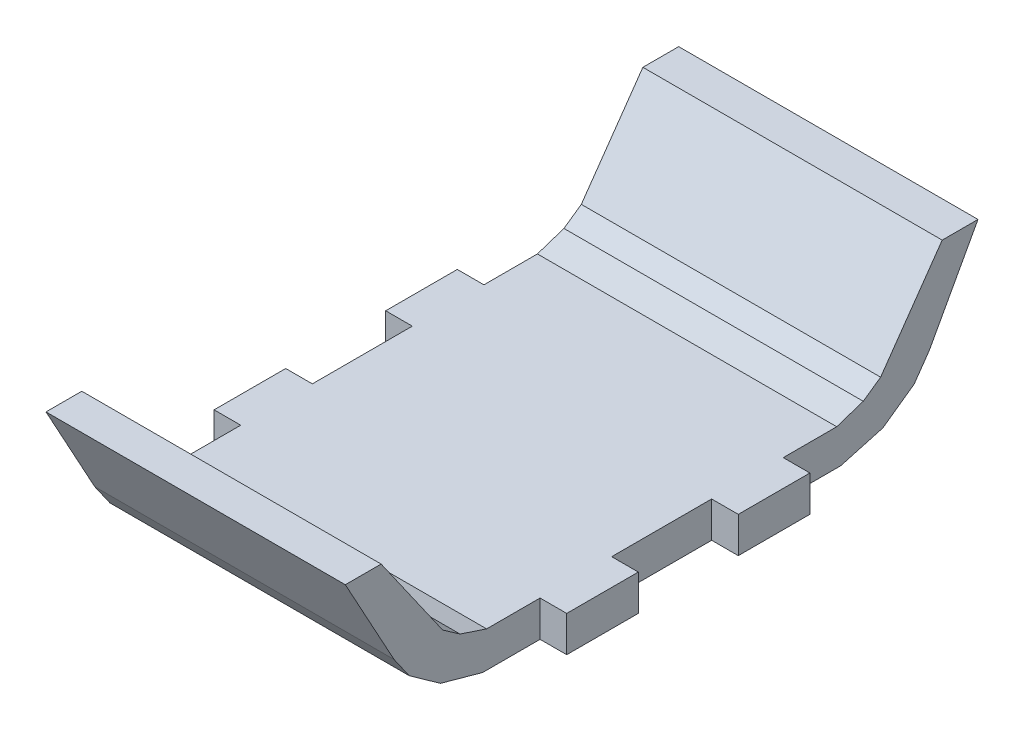
ISO-10303-21;
HEADER;
FILE_DESCRIPTION(('STEP AP214'),'2;1');
FILE_NAME('part.step','',(''),(''),'','','');
FILE_SCHEMA(('AUTOMOTIVE_DESIGN { 1 0 10303 214 1 1 1 1 }'));
ENDSEC;
DATA;
#1=APPLICATION_CONTEXT('core data for automotive mechanical design processes');
#2=APPLICATION_PROTOCOL_DEFINITION('international standard','automotive_design',2000,#1);
#3=PRODUCT_CONTEXT('',#1,'mechanical');
#4=PRODUCT('Part','Part','',(#3));
#5=PRODUCT_RELATED_PRODUCT_CATEGORY('part','',(#4));
#6=PRODUCT_DEFINITION_FORMATION('','',#4);
#7=PRODUCT_DEFINITION_CONTEXT('part definition',#1,'design');
#8=PRODUCT_DEFINITION('design','',#6,#7);
#9=PRODUCT_DEFINITION_SHAPE('','',#8);
#10=(LENGTH_UNIT() NAMED_UNIT(*) SI_UNIT(.MILLI.,.METRE.));
#11=(NAMED_UNIT(*) PLANE_ANGLE_UNIT() SI_UNIT($,.RADIAN.));
#12=(NAMED_UNIT(*) SI_UNIT($,.STERADIAN.) SOLID_ANGLE_UNIT());
#13=UNCERTAINTY_MEASURE_WITH_UNIT(LENGTH_MEASURE(1.E-05),#10,'distance_accuracy_value','');
#14=(GEOMETRIC_REPRESENTATION_CONTEXT(3) GLOBAL_UNCERTAINTY_ASSIGNED_CONTEXT((#13)) GLOBAL_UNIT_ASSIGNED_CONTEXT((#10,
#11,#12)) REPRESENTATION_CONTEXT('',''));
#15=CARTESIAN_POINT('',(0.,0.,0.));
#16=DIRECTION('',(0.,0.,1.));
#17=DIRECTION('',(1.,0.,0.));
#18=AXIS2_PLACEMENT_3D('',#15,#16,#17);
#19=CARTESIAN_POINT('',(10.45,2.5,8.49));
#20=DIRECTION('',(-1.,0.,0.));
#21=DIRECTION('',(0.,0.,1.));
#22=AXIS2_PLACEMENT_3D('',#19,#20,#21);
#23=PLANE('',#22);
#24=DIRECTION('',(0.,0.266976936378125,0.963702918664331));
#25=VECTOR('',#24,1.);
#26=CARTESIAN_POINT('',(10.45,-3.21608066004576,0.890958556973117));
#27=LINE('',#26,#25);
#28=CARTESIAN_POINT('',(10.45,0.,12.5));
#29=VERTEX_POINT('',#28);
#30=CARTESIAN_POINT('',(10.45,0.816274422686444,15.4464943835441));
#31=VERTEX_POINT('',#30);
#32=EDGE_CURVE('E297',#29,#31,#27,.T.);
#33=ORIENTED_EDGE('',*,*,#32,.F.);
#34=DIRECTION('',(0.,0.,-1.));
#35=VECTOR('',#34,1.);
#36=CARTESIAN_POINT('',(10.45,0.,8.49));
#37=LINE('',#36,#35);
#38=CARTESIAN_POINT('',(10.45,0.,8.49));
#39=VERTEX_POINT('',#38);
#40=EDGE_CURVE('E362',#29,#39,#37,.T.);
#41=ORIENTED_EDGE('',*,*,#40,.T.);
#42=DIRECTION('',(0.,-1.,0.));
#43=VECTOR('',#42,1.);
#44=CARTESIAN_POINT('',(10.45,2.5,8.49));
#45=LINE('',#44,#43);
#46=CARTESIAN_POINT('',(10.45,2.5,8.49));
#47=VERTEX_POINT('',#46);
#48=EDGE_CURVE('E11',#47,#39,#45,.T.);
#49=ORIENTED_EDGE('',*,*,#48,.F.);
#50=DIRECTION('',(0.,0.,-1.));
#51=VECTOR('',#50,1.);
#52=CARTESIAN_POINT('',(10.45,2.5,8.49));
#53=LINE('',#52,#51);
#54=CARTESIAN_POINT('',(10.45,2.5,12.2230371699178));
#55=VERTEX_POINT('',#54);
#56=EDGE_CURVE('E278',#55,#47,#53,.T.);
#57=ORIENTED_EDGE('',*,*,#56,.F.);
#58=DIRECTION('',(0.,0.315026182678689,0.949082980685511));
#59=VECTOR('',#58,1.);
#60=CARTESIAN_POINT('',(10.45,-1.4026205895499,0.465567520506252));
#61=LINE('',#60,#59);
#62=CARTESIAN_POINT('',(10.45,3.11522762752308,14.0765404741979));
#63=VERTEX_POINT('',#62);
#64=EDGE_CURVE('E260',#55,#63,#61,.T.);
#65=ORIENTED_EDGE('',*,*,#64,.T.);
#66=DIRECTION('',(0.,0.573576436351049,0.81915204428899));
#67=VECTOR('',#66,1.);
#68=CARTESIAN_POINT('',(10.45,-4.52346149130867,3.16736183501569));
#69=LINE('',#68,#67);
#70=CARTESIAN_POINT('',(10.45,3.96450824542418,15.289438895818));
#71=VERTEX_POINT('',#70);
#72=EDGE_CURVE('E275',#63,#71,#69,.T.);
#73=ORIENTED_EDGE('',*,*,#72,.T.);
#74=DIRECTION('',(0.,0.819152044288989,0.57357643635105));
#75=VECTOR('',#74,1.);
#76=CARTESIAN_POINT('',(10.45,-5.87940316962442,8.39665791753229));
#77=LINE('',#76,#75);
#78=CARTESIAN_POINT('',(10.45,10.1036954268661,19.5881440387441));
#79=VERTEX_POINT('',#78);
#80=EDGE_CURVE('E281',#71,#79,#77,.T.);
#81=ORIENTED_EDGE('',*,*,#80,.T.);
#82=DIRECTION('',(0.,0.,-1.));
#83=VECTOR('',#82,1.);
#84=CARTESIAN_POINT('',(10.45,10.1036954268661,0.));
#85=LINE('',#84,#83);
#86=CARTESIAN_POINT('',(10.45,10.1036954268661,22.0881440387441));
#87=VERTEX_POINT('',#86);
#88=EDGE_CURVE('E283',#87,#79,#85,.T.);
#89=ORIENTED_EDGE('',*,*,#88,.F.);
#90=DIRECTION('',(0.,0.877397149037787,0.47976477867843));
#91=VECTOR('',#90,1.);
#92=CARTESIAN_POINT('',(10.45,-6.97226675969061,12.7509297246345));
#93=LINE('',#92,#91);
#94=CARTESIAN_POINT('',(10.45,3.8818307141463,18.6859999240308));
#95=VERTEX_POINT('',#94);
#96=EDGE_CURVE('E288',#95,#87,#93,.T.);
#97=ORIENTED_EDGE('',*,*,#96,.F.);
#98=DIRECTION('',(0.,-0.819152044288989,-0.57357643635105));
#99=VECTOR('',#98,1.);
#100=CARTESIAN_POINT('',(10.45,-7.50246491184491,10.7146303095038));
#101=LINE('',#100,#99);
#102=CARTESIAN_POINT('',(10.45,2.37201677513664,17.6288168226421));
#103=VERTEX_POINT('',#102);
#104=EDGE_CURVE('E291',#95,#103,#101,.T.);
#105=ORIENTED_EDGE('',*,*,#104,.T.);
#106=DIRECTION('',(0.,-0.580482067399487,-0.814273031254024));
#107=VECTOR('',#106,1.);
#108=CARTESIAN_POINT('',(10.45,-6.75988522993769,4.81901279183265));
#109=LINE('',#108,#107);
#110=EDGE_CURVE('E294',#103,#31,#109,.T.);
#111=ORIENTED_EDGE('',*,*,#110,.T.);
#112=EDGE_LOOP('',(#33,#41,#49,#57,#65,#73,#81,#89,#97,#105,#111));
#113=FACE_BOUND('',#112,.T.);
#114=ADVANCED_FACE('F38',(#113),#23,.F.);
#115=CARTESIAN_POINT('',(10.45,2.5,8.49));
#116=DIRECTION('',(0.,0.,-1.));
#117=DIRECTION('',(-1.,0.,0.));
#118=AXIS2_PLACEMENT_3D('',#115,#116,#117);
#119=PLANE('',#118);
#120=DIRECTION('',(1.,0.,0.));
#121=VECTOR('',#120,1.);
#122=CARTESIAN_POINT('',(10.45,0.,8.49));
#123=LINE('',#122,#121);
#124=CARTESIAN_POINT('',(12.3099352059768,0.,8.49));
#125=VERTEX_POINT('',#124);
#126=EDGE_CURVE('E427',#39,#125,#123,.T.);
#127=ORIENTED_EDGE('',*,*,#126,.T.);
#128=DIRECTION('',(0.,-1.,0.));
#129=VECTOR('',#128,1.);
#130=CARTESIAN_POINT('',(12.3099352059768,2.5,8.49));
#131=LINE('',#130,#129);
#132=CARTESIAN_POINT('',(12.3099352059768,2.5,8.49));
#133=VERTEX_POINT('',#132);
#134=EDGE_CURVE('E45',#133,#125,#131,.T.);
#135=ORIENTED_EDGE('',*,*,#134,.F.);
#136=DIRECTION('',(1.,0.,0.));
#137=VECTOR('',#136,1.);
#138=CARTESIAN_POINT('',(10.45,2.5,8.49));
#139=LINE('',#138,#137);
#140=EDGE_CURVE('E390',#47,#133,#139,.T.);
#141=ORIENTED_EDGE('',*,*,#140,.F.);
#142=ORIENTED_EDGE('',*,*,#48,.T.);
#143=EDGE_LOOP('',(#127,#135,#141,#142));
#144=FACE_BOUND('',#143,.T.);
#145=ADVANCED_FACE('F531',(#144),#119,.F.);
#146=CARTESIAN_POINT('',(12.3099352059768,2.5,3.49));
#147=DIRECTION('',(-1.,0.,0.));
#148=DIRECTION('',(0.,0.,1.));
#149=AXIS2_PLACEMENT_3D('',#146,#147,#148);
#150=PLANE('',#149);
#151=DIRECTION('',(0.,0.,-1.));
#152=VECTOR('',#151,1.);
#153=CARTESIAN_POINT('',(12.3099352059768,0.,3.49));
#154=LINE('',#153,#152);
#155=CARTESIAN_POINT('',(12.3099352059768,0.,3.49));
#156=VERTEX_POINT('',#155);
#157=EDGE_CURVE('E429',#125,#156,#154,.T.);
#158=ORIENTED_EDGE('',*,*,#157,.T.);
#159=DIRECTION('',(0.,-1.,0.));
#160=VECTOR('',#159,1.);
#161=CARTESIAN_POINT('',(12.3099352059768,2.5,3.49));
#162=LINE('',#161,#160);
#163=CARTESIAN_POINT('',(12.3099352059768,2.5,3.49));
#164=VERTEX_POINT('',#163);
#165=EDGE_CURVE('E504',#164,#156,#162,.T.);
#166=ORIENTED_EDGE('',*,*,#165,.F.);
#167=DIRECTION('',(0.,0.,-1.));
#168=VECTOR('',#167,1.);
#169=CARTESIAN_POINT('',(12.3099352059768,2.5,3.49));
#170=LINE('',#169,#168);
#171=EDGE_CURVE('E393',#133,#164,#170,.T.);
#172=ORIENTED_EDGE('',*,*,#171,.F.);
#173=ORIENTED_EDGE('',*,*,#134,.T.);
#174=EDGE_LOOP('',(#158,#166,#172,#173));
#175=FACE_BOUND('',#174,.T.);
#176=ADVANCED_FACE('F511',(#175),#150,.F.);
#177=CARTESIAN_POINT('',(10.45,2.5,3.49));
#178=DIRECTION('',(0.,0.,1.));
#179=DIRECTION('',(1.,0.,0.));
#180=AXIS2_PLACEMENT_3D('',#177,#178,#179);
#181=PLANE('',#180);
#182=DIRECTION('',(-1.,0.,0.));
#183=VECTOR('',#182,1.);
#184=CARTESIAN_POINT('',(10.45,0.,3.49));
#185=LINE('',#184,#183);
#186=CARTESIAN_POINT('',(10.45,0.,3.49));
#187=VERTEX_POINT('',#186);
#188=EDGE_CURVE('E431',#156,#187,#185,.T.);
#189=ORIENTED_EDGE('',*,*,#188,.T.);
#190=DIRECTION('',(0.,-1.,0.));
#191=VECTOR('',#190,1.);
#192=CARTESIAN_POINT('',(10.45,2.5,3.49));
#193=LINE('',#192,#191);
#194=CARTESIAN_POINT('',(10.45,2.5,3.49));
#195=VERTEX_POINT('',#194);
#196=EDGE_CURVE('E501',#195,#187,#193,.T.);
#197=ORIENTED_EDGE('',*,*,#196,.F.);
#198=DIRECTION('',(-1.,0.,0.));
#199=VECTOR('',#198,1.);
#200=CARTESIAN_POINT('',(10.45,2.5,3.49));
#201=LINE('',#200,#199);
#202=EDGE_CURVE('E395',#164,#195,#201,.T.);
#203=ORIENTED_EDGE('',*,*,#202,.F.);
#204=ORIENTED_EDGE('',*,*,#165,.T.);
#205=EDGE_LOOP('',(#189,#197,#203,#204));
#206=FACE_BOUND('',#205,.T.);
#207=ADVANCED_FACE('F522',(#206),#181,.F.);
#208=CARTESIAN_POINT('',(10.45,2.5,-3.49));
#209=DIRECTION('',(-1.,0.,0.));
#210=DIRECTION('',(0.,0.,1.));
#211=AXIS2_PLACEMENT_3D('',#208,#209,#210);
#212=PLANE('',#211);
#213=DIRECTION('',(0.,0.,-1.));
#214=VECTOR('',#213,1.);
#215=CARTESIAN_POINT('',(10.45,0.,-3.49));
#216=LINE('',#215,#214);
#217=CARTESIAN_POINT('',(10.45,0.,-3.49));
#218=VERTEX_POINT('',#217);
#219=EDGE_CURVE('E433',#187,#218,#216,.T.);
#220=ORIENTED_EDGE('',*,*,#219,.T.);
#221=DIRECTION('',(0.,-1.,0.));
#222=VECTOR('',#221,1.);
#223=CARTESIAN_POINT('',(10.45,2.5,-3.49));
#224=LINE('',#223,#222);
#225=CARTESIAN_POINT('',(10.45,2.5,-3.49));
#226=VERTEX_POINT('',#225);
#227=EDGE_CURVE('E498',#226,#218,#224,.T.);
#228=ORIENTED_EDGE('',*,*,#227,.F.);
#229=DIRECTION('',(0.,0.,-1.));
#230=VECTOR('',#229,1.);
#231=CARTESIAN_POINT('',(10.45,2.5,-3.49));
#232=LINE('',#231,#230);
#233=EDGE_CURVE('E397',#195,#226,#232,.T.);
#234=ORIENTED_EDGE('',*,*,#233,.F.);
#235=ORIENTED_EDGE('',*,*,#196,.T.);
#236=EDGE_LOOP('',(#220,#228,#234,#235));
#237=FACE_BOUND('',#236,.T.);
#238=ADVANCED_FACE('F526',(#237),#212,.F.);
#239=CARTESIAN_POINT('',(10.45,2.5,-3.49));
#240=DIRECTION('',(0.,0.,-1.));
#241=DIRECTION('',(-1.,0.,0.));
#242=AXIS2_PLACEMENT_3D('',#239,#240,#241);
#243=PLANE('',#242);
#244=DIRECTION('',(1.,0.,0.));
#245=VECTOR('',#244,1.);
#246=CARTESIAN_POINT('',(10.45,0.,-3.49));
#247=LINE('',#246,#245);
#248=CARTESIAN_POINT('',(12.3099352059768,0.,-3.49));
#249=VERTEX_POINT('',#248);
#250=EDGE_CURVE('E435',#218,#249,#247,.T.);
#251=ORIENTED_EDGE('',*,*,#250,.T.);
#252=DIRECTION('',(0.,-1.,0.));
#253=VECTOR('',#252,1.);
#254=CARTESIAN_POINT('',(12.3099352059768,2.5,-3.49));
#255=LINE('',#254,#253);
#256=CARTESIAN_POINT('',(12.3099352059768,2.5,-3.49));
#257=VERTEX_POINT('',#256);
#258=EDGE_CURVE('E495',#257,#249,#255,.T.);
#259=ORIENTED_EDGE('',*,*,#258,.F.);
#260=DIRECTION('',(1.,0.,0.));
#261=VECTOR('',#260,1.);
#262=CARTESIAN_POINT('',(10.45,2.5,-3.49));
#263=LINE('',#262,#261);
#264=EDGE_CURVE('E399',#226,#257,#263,.T.);
#265=ORIENTED_EDGE('',*,*,#264,.F.);
#266=ORIENTED_EDGE('',*,*,#227,.T.);
#267=EDGE_LOOP('',(#251,#259,#265,#266));
#268=FACE_BOUND('',#267,.T.);
#269=ADVANCED_FACE('F605',(#268),#243,.F.);
#270=CARTESIAN_POINT('',(12.3099352059768,2.5,-8.49));
#271=DIRECTION('',(-1.,0.,0.));
#272=DIRECTION('',(0.,0.,1.));
#273=AXIS2_PLACEMENT_3D('',#270,#271,#272);
#274=PLANE('',#273);
#275=DIRECTION('',(0.,0.,-1.));
#276=VECTOR('',#275,1.);
#277=CARTESIAN_POINT('',(12.3099352059768,0.,-8.49));
#278=LINE('',#277,#276);
#279=CARTESIAN_POINT('',(12.3099352059768,0.,-8.49));
#280=VERTEX_POINT('',#279);
#281=EDGE_CURVE('E437',#249,#280,#278,.T.);
#282=ORIENTED_EDGE('',*,*,#281,.T.);
#283=DIRECTION('',(0.,-1.,0.));
#284=VECTOR('',#283,1.);
#285=CARTESIAN_POINT('',(12.3099352059768,2.5,-8.49));
#286=LINE('',#285,#284);
#287=CARTESIAN_POINT('',(12.3099352059768,2.5,-8.49));
#288=VERTEX_POINT('',#287);
#289=EDGE_CURVE('E492',#288,#280,#286,.T.);
#290=ORIENTED_EDGE('',*,*,#289,.F.);
#291=DIRECTION('',(0.,0.,-1.));
#292=VECTOR('',#291,1.);
#293=CARTESIAN_POINT('',(12.3099352059768,2.5,-8.49));
#294=LINE('',#293,#292);
#295=EDGE_CURVE('E401',#257,#288,#294,.T.);
#296=ORIENTED_EDGE('',*,*,#295,.F.);
#297=ORIENTED_EDGE('',*,*,#258,.T.);
#298=EDGE_LOOP('',(#282,#290,#296,#297));
#299=FACE_BOUND('',#298,.T.);
#300=ADVANCED_FACE('F603',(#299),#274,.F.);
#301=CARTESIAN_POINT('',(10.45,2.5,-8.49));
#302=DIRECTION('',(0.,0.,1.));
#303=DIRECTION('',(1.,0.,0.));
#304=AXIS2_PLACEMENT_3D('',#301,#302,#303);
#305=PLANE('',#304);
#306=DIRECTION('',(-1.,0.,0.));
#307=VECTOR('',#306,1.);
#308=CARTESIAN_POINT('',(10.45,0.,-8.49));
#309=LINE('',#308,#307);
#310=CARTESIAN_POINT('',(10.45,0.,-8.49));
#311=VERTEX_POINT('',#310);
#312=EDGE_CURVE('E439',#280,#311,#309,.T.);
#313=ORIENTED_EDGE('',*,*,#312,.T.);
#314=DIRECTION('',(0.,-1.,0.));
#315=VECTOR('',#314,1.);
#316=CARTESIAN_POINT('',(10.45,2.5,-8.49));
#317=LINE('',#316,#315);
#318=CARTESIAN_POINT('',(10.45,2.5,-8.49));
#319=VERTEX_POINT('',#318);
#320=EDGE_CURVE('E489',#319,#311,#317,.T.);
#321=ORIENTED_EDGE('',*,*,#320,.F.);
#322=DIRECTION('',(-1.,0.,0.));
#323=VECTOR('',#322,1.);
#324=CARTESIAN_POINT('',(10.45,2.5,-8.49));
#325=LINE('',#324,#323);
#326=EDGE_CURVE('E403',#288,#319,#325,.T.);
#327=ORIENTED_EDGE('',*,*,#326,.F.);
#328=ORIENTED_EDGE('',*,*,#289,.T.);
#329=EDGE_LOOP('',(#313,#321,#327,#328));
#330=FACE_BOUND('',#329,.T.);
#331=ADVANCED_FACE('F599',(#330),#305,.F.);
#332=CARTESIAN_POINT('',(10.45,2.5,-12.5));
#333=DIRECTION('',(-1.,0.,0.));
#334=DIRECTION('',(0.,0.,1.));
#335=AXIS2_PLACEMENT_3D('',#332,#333,#334);
#336=PLANE('',#335);
#337=DIRECTION('',(0.,0.,-1.));
#338=VECTOR('',#337,1.);
#339=CARTESIAN_POINT('',(10.45,0.,-12.5));
#340=LINE('',#339,#338);
#341=CARTESIAN_POINT('',(10.45,0.,-12.5));
#342=VERTEX_POINT('',#341);
#343=EDGE_CURVE('E441',#311,#342,#340,.T.);
#344=ORIENTED_EDGE('',*,*,#343,.T.);
#345=DIRECTION('',(0.,0.266976936378125,-0.963702918664331));
#346=VECTOR('',#345,1.);
#347=CARTESIAN_POINT('',(10.45,-3.21608066004576,-0.890958556973117));
#348=LINE('',#347,#346);
#349=CARTESIAN_POINT('',(10.45,0.816274422686444,-15.4464943835441));
#350=VERTEX_POINT('',#349);
#351=EDGE_CURVE('E300',#342,#350,#348,.T.);
#352=ORIENTED_EDGE('',*,*,#351,.T.);
#353=DIRECTION('',(0.,-0.580482067399487,0.814273031254024));
#354=VECTOR('',#353,1.);
#355=CARTESIAN_POINT('',(10.45,-6.75988522993769,-4.81901279183265));
#356=LINE('',#355,#354);
#357=CARTESIAN_POINT('',(10.45,2.37201677513664,-17.6288168226421));
#358=VERTEX_POINT('',#357);
#359=EDGE_CURVE('E303',#358,#350,#356,.T.);
#360=ORIENTED_EDGE('',*,*,#359,.F.);
#361=DIRECTION('',(0.,-0.81915204428899,0.573576436351049));
#362=VECTOR('',#361,1.);
#363=CARTESIAN_POINT('',(10.45,-7.5024649118449,-10.7146303095039));
#364=LINE('',#363,#362);
#365=CARTESIAN_POINT('',(10.45,3.88183071414631,-18.6859999240308));
#366=VERTEX_POINT('',#365);
#367=EDGE_CURVE('E306',#366,#358,#364,.T.);
#368=ORIENTED_EDGE('',*,*,#367,.F.);
#369=DIRECTION('',(0.,0.877397149037789,-0.479764778678427));
#370=VECTOR('',#369,1.);
#371=CARTESIAN_POINT('',(10.45,-6.97226675969059,-12.7509297246345));
#372=LINE('',#371,#370);
#373=CARTESIAN_POINT('',(10.45,10.1036954268662,-22.0881440387441));
#374=VERTEX_POINT('',#373);
#375=EDGE_CURVE('E309',#366,#374,#372,.T.);
#376=ORIENTED_EDGE('',*,*,#375,.T.);
#377=DIRECTION('',(0.,0.,1.));
#378=VECTOR('',#377,1.);
#379=CARTESIAN_POINT('',(10.45,10.103695426866,0.));
#380=LINE('',#379,#378);
#381=CARTESIAN_POINT('',(10.45,10.1036954268661,-19.5881440387441));
#382=VERTEX_POINT('',#381);
#383=EDGE_CURVE('E312',#374,#382,#380,.T.);
#384=ORIENTED_EDGE('',*,*,#383,.T.);
#385=DIRECTION('',(0.,0.819152044288989,-0.57357643635105));
#386=VECTOR('',#385,1.);
#387=CARTESIAN_POINT('',(10.45,-5.87940316962442,-8.39665791753229));
#388=LINE('',#387,#386);
#389=CARTESIAN_POINT('',(10.45,3.96450824542418,-15.289438895818));
#390=VERTEX_POINT('',#389);
#391=EDGE_CURVE('E315',#390,#382,#388,.T.);
#392=ORIENTED_EDGE('',*,*,#391,.F.);
#393=DIRECTION('',(0.,0.573576436351052,-0.819152044288988));
#394=VECTOR('',#393,1.);
#395=CARTESIAN_POINT('',(10.45,-4.52346149130871,-3.16736183501574));
#396=LINE('',#395,#394);
#397=CARTESIAN_POINT('',(10.45,3.11522762752308,-14.0765404741979));
#398=VERTEX_POINT('',#397);
#399=EDGE_CURVE('E318',#398,#390,#396,.T.);
#400=ORIENTED_EDGE('',*,*,#399,.F.);
#401=DIRECTION('',(0.,0.315026182678686,-0.949082980685512));
#402=VECTOR('',#401,1.);
#403=CARTESIAN_POINT('',(10.45,-1.40262058954987,-0.465567520506239));
#404=LINE('',#403,#402);
#405=CARTESIAN_POINT('',(10.45,2.5,-12.2230371699178));
#406=VERTEX_POINT('',#405);
#407=EDGE_CURVE('E321',#406,#398,#404,.T.);
#408=ORIENTED_EDGE('',*,*,#407,.F.);
#409=DIRECTION('',(0.,0.,-1.));
#410=VECTOR('',#409,1.);
#411=CARTESIAN_POINT('',(10.45,2.5,-12.5));
#412=LINE('',#411,#410);
#413=EDGE_CURVE('E405',#319,#406,#412,.T.);
#414=ORIENTED_EDGE('',*,*,#413,.F.);
#415=ORIENTED_EDGE('',*,*,#320,.T.);
#416=EDGE_LOOP('',(#344,#352,#360,#368,#376,#384,#392,#400,#408,#414,#415));
#417=FACE_BOUND('',#416,.T.);
#418=ADVANCED_FACE('F592',(#417),#336,.F.);
#419=CARTESIAN_POINT('',(-10.45,2.5,-12.5));
#420=DIRECTION('',(1.,0.,0.));
#421=DIRECTION('',(0.,0.,-1.));
#422=AXIS2_PLACEMENT_3D('',#419,#420,#421);
#423=PLANE('',#422);
#424=DIRECTION('',(0.,0.266976936378125,-0.963702918664331));
#425=VECTOR('',#424,1.);
#426=CARTESIAN_POINT('',(-10.45,-3.21608066004576,-0.890958556973117));
#427=LINE('',#426,#425);
#428=CARTESIAN_POINT('',(-10.45,0.,-12.5));
#429=VERTEX_POINT('',#428);
#430=CARTESIAN_POINT('',(-10.45,0.816274422686444,-15.4464943835441));
#431=VERTEX_POINT('',#430);
#432=EDGE_CURVE('E342',#429,#431,#427,.T.);
#433=ORIENTED_EDGE('',*,*,#432,.F.);
#434=DIRECTION('',(0.,0.,1.));
#435=VECTOR('',#434,1.);
#436=CARTESIAN_POINT('',(-10.45,0.,-12.5));
#437=LINE('',#436,#435);
#438=CARTESIAN_POINT('',(-10.45,0.,-8.49));
#439=VERTEX_POINT('',#438);
#440=EDGE_CURVE('E446',#429,#439,#437,.T.);
#441=ORIENTED_EDGE('',*,*,#440,.T.);
#442=DIRECTION('',(0.,-1.,0.));
#443=VECTOR('',#442,1.);
#444=CARTESIAN_POINT('',(-10.45,2.5,-8.49));
#445=LINE('',#444,#443);
#446=CARTESIAN_POINT('',(-10.45,2.5,-8.49));
#447=VERTEX_POINT('',#446);
#448=EDGE_CURVE('E486',#447,#439,#445,.T.);
#449=ORIENTED_EDGE('',*,*,#448,.F.);
#450=DIRECTION('',(0.,0.,1.));
#451=VECTOR('',#450,1.);
#452=CARTESIAN_POINT('',(-10.45,2.5,-12.5));
#453=LINE('',#452,#451);
#454=CARTESIAN_POINT('',(-10.45,2.5,-12.2230371699178));
#455=VERTEX_POINT('',#454);
#456=EDGE_CURVE('E407',#455,#447,#453,.T.);
#457=ORIENTED_EDGE('',*,*,#456,.F.);
#458=DIRECTION('',(0.,0.315026182678686,-0.949082980685512));
#459=VECTOR('',#458,1.);
#460=CARTESIAN_POINT('',(-10.45,-1.40262058954987,-0.465567520506239));
#461=LINE('',#460,#459);
#462=CARTESIAN_POINT('',(-10.45,3.11522762752308,-14.0765404741979));
#463=VERTEX_POINT('',#462);
#464=EDGE_CURVE('E359',#455,#463,#461,.T.);
#465=ORIENTED_EDGE('',*,*,#464,.T.);
#466=DIRECTION('',(0.,0.573576436351052,-0.819152044288988));
#467=VECTOR('',#466,1.);
#468=CARTESIAN_POINT('',(-10.45,-4.52346149130871,-3.16736183501574));
#469=LINE('',#468,#467);
#470=CARTESIAN_POINT('',(-10.45,3.96450824542418,-15.289438895818));
#471=VERTEX_POINT('',#470);
#472=EDGE_CURVE('E357',#463,#471,#469,.T.);
#473=ORIENTED_EDGE('',*,*,#472,.T.);
#474=DIRECTION('',(0.,0.819152044288989,-0.57357643635105));
#475=VECTOR('',#474,1.);
#476=CARTESIAN_POINT('',(-10.45,-5.87940316962442,-8.39665791753229));
#477=LINE('',#476,#475);
#478=CARTESIAN_POINT('',(-10.45,10.1036954268661,-19.5881440387441));
#479=VERTEX_POINT('',#478);
#480=EDGE_CURVE('E355',#471,#479,#477,.T.);
#481=ORIENTED_EDGE('',*,*,#480,.T.);
#482=DIRECTION('',(0.,0.,1.));
#483=VECTOR('',#482,1.);
#484=CARTESIAN_POINT('',(-10.45,10.103695426866,0.));
#485=LINE('',#484,#483);
#486=CARTESIAN_POINT('',(-10.45,10.1036954268662,-22.0881440387441));
#487=VERTEX_POINT('',#486);
#488=EDGE_CURVE('E352',#487,#479,#485,.T.);
#489=ORIENTED_EDGE('',*,*,#488,.F.);
#490=DIRECTION('',(0.,0.877397149037789,-0.479764778678427));
#491=VECTOR('',#490,1.);
#492=CARTESIAN_POINT('',(-10.45,-6.97226675969059,-12.7509297246345));
#493=LINE('',#492,#491);
#494=CARTESIAN_POINT('',(-10.45,3.88183071414631,-18.6859999240308));
#495=VERTEX_POINT('',#494);
#496=EDGE_CURVE('E349',#495,#487,#493,.T.);
#497=ORIENTED_EDGE('',*,*,#496,.F.);
#498=DIRECTION('',(0.,-0.81915204428899,0.573576436351049));
#499=VECTOR('',#498,1.);
#500=CARTESIAN_POINT('',(-10.45,-7.5024649118449,-10.7146303095039));
#501=LINE('',#500,#499);
#502=CARTESIAN_POINT('',(-10.45,2.37201677513664,-17.6288168226421));
#503=VERTEX_POINT('',#502);
#504=EDGE_CURVE('E347',#495,#503,#501,.T.);
#505=ORIENTED_EDGE('',*,*,#504,.T.);
#506=DIRECTION('',(0.,-0.580482067399487,0.814273031254024));
#507=VECTOR('',#506,1.);
#508=CARTESIAN_POINT('',(-10.45,-6.75988522993769,-4.81901279183265));
#509=LINE('',#508,#507);
#510=EDGE_CURVE('E345',#503,#431,#509,.T.);
#511=ORIENTED_EDGE('',*,*,#510,.T.);
#512=EDGE_LOOP('',(#433,#441,#449,#457,#465,#473,#481,#489,#497,#505,#511));
#513=FACE_BOUND('',#512,.T.);
#514=ADVANCED_FACE('F581',(#513),#423,.F.);
#515=CARTESIAN_POINT('',(-10.45,2.5,-8.49));
#516=DIRECTION('',(0.,0.,1.));
#517=DIRECTION('',(1.,0.,0.));
#518=AXIS2_PLACEMENT_3D('',#515,#516,#517);
#519=PLANE('',#518);
#520=DIRECTION('',(-1.,0.,0.));
#521=VECTOR('',#520,1.);
#522=CARTESIAN_POINT('',(-10.45,0.,-8.49));
#523=LINE('',#522,#521);
#524=CARTESIAN_POINT('',(-12.3099352059768,0.,-8.49));
#525=VERTEX_POINT('',#524);
#526=EDGE_CURVE('E448',#439,#525,#523,.T.);
#527=ORIENTED_EDGE('',*,*,#526,.T.);
#528=DIRECTION('',(0.,-1.,0.));
#529=VECTOR('',#528,1.);
#530=CARTESIAN_POINT('',(-12.3099352059768,2.5,-8.49));
#531=LINE('',#530,#529);
#532=CARTESIAN_POINT('',(-12.3099352059768,2.5,-8.49));
#533=VERTEX_POINT('',#532);
#534=EDGE_CURVE('E483',#533,#525,#531,.T.);
#535=ORIENTED_EDGE('',*,*,#534,.F.);
#536=DIRECTION('',(-1.,0.,0.));
#537=VECTOR('',#536,1.);
#538=CARTESIAN_POINT('',(-10.45,2.5,-8.49));
#539=LINE('',#538,#537);
#540=EDGE_CURVE('E409',#447,#533,#539,.T.);
#541=ORIENTED_EDGE('',*,*,#540,.F.);
#542=ORIENTED_EDGE('',*,*,#448,.T.);
#543=EDGE_LOOP('',(#527,#535,#541,#542));
#544=FACE_BOUND('',#543,.T.);
#545=ADVANCED_FACE('F576',(#544),#519,.F.);
#546=CARTESIAN_POINT('',(-12.3099352059768,2.5,-8.49));
#547=DIRECTION('',(1.,0.,0.));
#548=DIRECTION('',(0.,0.,-1.));
#549=AXIS2_PLACEMENT_3D('',#546,#547,#548);
#550=PLANE('',#549);
#551=DIRECTION('',(0.,0.,1.));
#552=VECTOR('',#551,1.);
#553=CARTESIAN_POINT('',(-12.3099352059768,0.,-8.49));
#554=LINE('',#553,#552);
#555=CARTESIAN_POINT('',(-12.3099352059768,0.,-3.49));
#556=VERTEX_POINT('',#555);
#557=EDGE_CURVE('E450',#525,#556,#554,.T.);
#558=ORIENTED_EDGE('',*,*,#557,.T.);
#559=DIRECTION('',(0.,-1.,0.));
#560=VECTOR('',#559,1.);
#561=CARTESIAN_POINT('',(-12.3099352059768,2.5,-3.49));
#562=LINE('',#561,#560);
#563=CARTESIAN_POINT('',(-12.3099352059768,2.5,-3.49));
#564=VERTEX_POINT('',#563);
#565=EDGE_CURVE('E480',#564,#556,#562,.T.);
#566=ORIENTED_EDGE('',*,*,#565,.F.);
#567=DIRECTION('',(0.,0.,1.));
#568=VECTOR('',#567,1.);
#569=CARTESIAN_POINT('',(-12.3099352059768,2.5,-8.49));
#570=LINE('',#569,#568);
#571=EDGE_CURVE('E411',#533,#564,#570,.T.);
#572=ORIENTED_EDGE('',*,*,#571,.F.);
#573=ORIENTED_EDGE('',*,*,#534,.T.);
#574=EDGE_LOOP('',(#558,#566,#572,#573));
#575=FACE_BOUND('',#574,.T.);
#576=ADVANCED_FACE('F571',(#575),#550,.F.);
#577=CARTESIAN_POINT('',(-10.45,2.5,-3.49));
#578=DIRECTION('',(0.,0.,-1.));
#579=DIRECTION('',(-1.,0.,0.));
#580=AXIS2_PLACEMENT_3D('',#577,#578,#579);
#581=PLANE('',#580);
#582=DIRECTION('',(1.,0.,0.));
#583=VECTOR('',#582,1.);
#584=CARTESIAN_POINT('',(-10.45,0.,-3.49));
#585=LINE('',#584,#583);
#586=CARTESIAN_POINT('',(-10.45,0.,-3.49));
#587=VERTEX_POINT('',#586);
#588=EDGE_CURVE('E452',#556,#587,#585,.T.);
#589=ORIENTED_EDGE('',*,*,#588,.T.);
#590=DIRECTION('',(0.,-1.,0.));
#591=VECTOR('',#590,1.);
#592=CARTESIAN_POINT('',(-10.45,2.5,-3.49));
#593=LINE('',#592,#591);
#594=CARTESIAN_POINT('',(-10.45,2.5,-3.49));
#595=VERTEX_POINT('',#594);
#596=EDGE_CURVE('E477',#595,#587,#593,.T.);
#597=ORIENTED_EDGE('',*,*,#596,.F.);
#598=DIRECTION('',(1.,0.,0.));
#599=VECTOR('',#598,1.);
#600=CARTESIAN_POINT('',(-10.45,2.5,-3.49));
#601=LINE('',#600,#599);
#602=EDGE_CURVE('E413',#564,#595,#601,.T.);
#603=ORIENTED_EDGE('',*,*,#602,.F.);
#604=ORIENTED_EDGE('',*,*,#565,.T.);
#605=EDGE_LOOP('',(#589,#597,#603,#604));
#606=FACE_BOUND('',#605,.T.);
#607=ADVANCED_FACE('F567',(#606),#581,.F.);
#608=CARTESIAN_POINT('',(-10.45,2.5,-3.49));
#609=DIRECTION('',(1.,0.,0.));
#610=DIRECTION('',(0.,0.,-1.));
#611=AXIS2_PLACEMENT_3D('',#608,#609,#610);
#612=PLANE('',#611);
#613=DIRECTION('',(0.,0.,1.));
#614=VECTOR('',#613,1.);
#615=CARTESIAN_POINT('',(-10.45,0.,-3.49));
#616=LINE('',#615,#614);
#617=CARTESIAN_POINT('',(-10.45,0.,3.49));
#618=VERTEX_POINT('',#617);
#619=EDGE_CURVE('E454',#587,#618,#616,.T.);
#620=ORIENTED_EDGE('',*,*,#619,.T.);
#621=DIRECTION('',(0.,-1.,0.));
#622=VECTOR('',#621,1.);
#623=CARTESIAN_POINT('',(-10.45,2.5,3.49));
#624=LINE('',#623,#622);
#625=CARTESIAN_POINT('',(-10.45,2.5,3.49));
#626=VERTEX_POINT('',#625);
#627=EDGE_CURVE('E474',#626,#618,#624,.T.);
#628=ORIENTED_EDGE('',*,*,#627,.F.);
#629=DIRECTION('',(0.,0.,1.));
#630=VECTOR('',#629,1.);
#631=CARTESIAN_POINT('',(-10.45,2.5,-3.49));
#632=LINE('',#631,#630);
#633=EDGE_CURVE('E415',#595,#626,#632,.T.);
#634=ORIENTED_EDGE('',*,*,#633,.F.);
#635=ORIENTED_EDGE('',*,*,#596,.T.);
#636=EDGE_LOOP('',(#620,#628,#634,#635));
#637=FACE_BOUND('',#636,.T.);
#638=ADVANCED_FACE('F562',(#637),#612,.F.);
#639=CARTESIAN_POINT('',(-10.45,2.5,3.49));
#640=DIRECTION('',(0.,0.,1.));
#641=DIRECTION('',(1.,0.,0.));
#642=AXIS2_PLACEMENT_3D('',#639,#640,#641);
#643=PLANE('',#642);
#644=DIRECTION('',(-1.,0.,0.));
#645=VECTOR('',#644,1.);
#646=CARTESIAN_POINT('',(-10.45,0.,3.49));
#647=LINE('',#646,#645);
#648=CARTESIAN_POINT('',(-12.3099352059768,0.,3.49));
#649=VERTEX_POINT('',#648);
#650=EDGE_CURVE('E456',#618,#649,#647,.T.);
#651=ORIENTED_EDGE('',*,*,#650,.T.);
#652=DIRECTION('',(0.,-1.,0.));
#653=VECTOR('',#652,1.);
#654=CARTESIAN_POINT('',(-12.3099352059768,2.5,3.49));
#655=LINE('',#654,#653);
#656=CARTESIAN_POINT('',(-12.3099352059768,2.5,3.49));
#657=VERTEX_POINT('',#656);
#658=EDGE_CURVE('E471',#657,#649,#655,.T.);
#659=ORIENTED_EDGE('',*,*,#658,.F.);
#660=DIRECTION('',(-1.,0.,0.));
#661=VECTOR('',#660,1.);
#662=CARTESIAN_POINT('',(-10.45,2.5,3.49));
#663=LINE('',#662,#661);
#664=EDGE_CURVE('E417',#626,#657,#663,.T.);
#665=ORIENTED_EDGE('',*,*,#664,.F.);
#666=ORIENTED_EDGE('',*,*,#627,.T.);
#667=EDGE_LOOP('',(#651,#659,#665,#666));
#668=FACE_BOUND('',#667,.T.);
#669=ADVANCED_FACE('F556',(#668),#643,.F.);
#670=CARTESIAN_POINT('',(-12.3099352059768,2.5,3.49));
#671=DIRECTION('',(1.,0.,0.));
#672=DIRECTION('',(0.,0.,-1.));
#673=AXIS2_PLACEMENT_3D('',#670,#671,#672);
#674=PLANE('',#673);
#675=DIRECTION('',(0.,0.,1.));
#676=VECTOR('',#675,1.);
#677=CARTESIAN_POINT('',(-12.3099352059768,0.,3.49));
#678=LINE('',#677,#676);
#679=CARTESIAN_POINT('',(-12.3099352059768,0.,8.49));
#680=VERTEX_POINT('',#679);
#681=EDGE_CURVE('E458',#649,#680,#678,.T.);
#682=ORIENTED_EDGE('',*,*,#681,.T.);
#683=DIRECTION('',(0.,-1.,0.));
#684=VECTOR('',#683,1.);
#685=CARTESIAN_POINT('',(-12.3099352059768,2.5,8.49));
#686=LINE('',#685,#684);
#687=CARTESIAN_POINT('',(-12.3099352059768,2.5,8.49));
#688=VERTEX_POINT('',#687);
#689=EDGE_CURVE('E468',#688,#680,#686,.T.);
#690=ORIENTED_EDGE('',*,*,#689,.F.);
#691=DIRECTION('',(0.,0.,1.));
#692=VECTOR('',#691,1.);
#693=CARTESIAN_POINT('',(-12.3099352059768,2.5,3.49));
#694=LINE('',#693,#692);
#695=EDGE_CURVE('E419',#657,#688,#694,.T.);
#696=ORIENTED_EDGE('',*,*,#695,.F.);
#697=ORIENTED_EDGE('',*,*,#658,.T.);
#698=EDGE_LOOP('',(#682,#690,#696,#697));
#699=FACE_BOUND('',#698,.T.);
#700=ADVANCED_FACE('F552',(#699),#674,.F.);
#701=CARTESIAN_POINT('',(-10.45,2.5,8.49));
#702=DIRECTION('',(0.,0.,-1.));
#703=DIRECTION('',(-1.,0.,0.));
#704=AXIS2_PLACEMENT_3D('',#701,#702,#703);
#705=PLANE('',#704);
#706=DIRECTION('',(1.,0.,0.));
#707=VECTOR('',#706,1.);
#708=CARTESIAN_POINT('',(-10.45,0.,8.49));
#709=LINE('',#708,#707);
#710=CARTESIAN_POINT('',(-10.45,0.,8.49));
#711=VERTEX_POINT('',#710);
#712=EDGE_CURVE('E460',#680,#711,#709,.T.);
#713=ORIENTED_EDGE('',*,*,#712,.T.);
#714=DIRECTION('',(0.,-1.,0.));
#715=VECTOR('',#714,1.);
#716=CARTESIAN_POINT('',(-10.45,2.5,8.49));
#717=LINE('',#716,#715);
#718=CARTESIAN_POINT('',(-10.45,2.5,8.49));
#719=VERTEX_POINT('',#718);
#720=EDGE_CURVE('E424',#719,#711,#717,.T.);
#721=ORIENTED_EDGE('',*,*,#720,.F.);
#722=DIRECTION('',(1.,0.,0.));
#723=VECTOR('',#722,1.);
#724=CARTESIAN_POINT('',(-10.45,2.5,8.49));
#725=LINE('',#724,#723);
#726=EDGE_CURVE('E421',#688,#719,#725,.T.);
#727=ORIENTED_EDGE('',*,*,#726,.F.);
#728=ORIENTED_EDGE('',*,*,#689,.T.);
#729=EDGE_LOOP('',(#713,#721,#727,#728));
#730=FACE_BOUND('',#729,.T.);
#731=ADVANCED_FACE('F547',(#730),#705,.F.);
#732=CARTESIAN_POINT('',(-10.45,2.5,8.49));
#733=DIRECTION('',(1.,0.,0.));
#734=DIRECTION('',(0.,0.,-1.));
#735=AXIS2_PLACEMENT_3D('',#732,#733,#734);
#736=PLANE('',#735);
#737=DIRECTION('',(0.,0.,1.));
#738=VECTOR('',#737,1.);
#739=CARTESIAN_POINT('',(-10.45,0.,8.49));
#740=LINE('',#739,#738);
#741=CARTESIAN_POINT('',(-10.45,0.,12.5));
#742=VERTEX_POINT('',#741);
#743=EDGE_CURVE('E462',#711,#742,#740,.T.);
#744=ORIENTED_EDGE('',*,*,#743,.T.);
#745=DIRECTION('',(0.,0.266976936378125,0.963702918664331));
#746=VECTOR('',#745,1.);
#747=CARTESIAN_POINT('',(-10.45,-3.21608066004576,0.890958556973117));
#748=LINE('',#747,#746);
#749=CARTESIAN_POINT('',(-10.45,0.816274422686444,15.4464943835441));
#750=VERTEX_POINT('',#749);
#751=EDGE_CURVE('E340',#742,#750,#748,.T.);
#752=ORIENTED_EDGE('',*,*,#751,.T.);
#753=DIRECTION('',(0.,-0.580482067399487,-0.814273031254024));
#754=VECTOR('',#753,1.);
#755=CARTESIAN_POINT('',(-10.45,-6.75988522993769,4.81901279183265));
#756=LINE('',#755,#754);
#757=CARTESIAN_POINT('',(-10.45,2.37201677513664,17.6288168226421));
#758=VERTEX_POINT('',#757);
#759=EDGE_CURVE('E337',#758,#750,#756,.T.);
#760=ORIENTED_EDGE('',*,*,#759,.F.);
#761=DIRECTION('',(0.,-0.819152044288989,-0.57357643635105));
#762=VECTOR('',#761,1.);
#763=CARTESIAN_POINT('',(-10.45,-7.50246491184491,10.7146303095038));
#764=LINE('',#763,#762);
#765=CARTESIAN_POINT('',(-10.45,3.8818307141463,18.6859999240308));
#766=VERTEX_POINT('',#765);
#767=EDGE_CURVE('E334',#766,#758,#764,.T.);
#768=ORIENTED_EDGE('',*,*,#767,.F.);
#769=DIRECTION('',(0.,0.877397149037787,0.47976477867843));
#770=VECTOR('',#769,1.);
#771=CARTESIAN_POINT('',(-10.45,-6.97226675969061,12.7509297246345));
#772=LINE('',#771,#770);
#773=CARTESIAN_POINT('',(-10.45,10.1036954268661,22.0881440387441));
#774=VERTEX_POINT('',#773);
#775=EDGE_CURVE('E332',#766,#774,#772,.T.);
#776=ORIENTED_EDGE('',*,*,#775,.T.);
#777=DIRECTION('',(0.,0.,-1.));
#778=VECTOR('',#777,1.);
#779=CARTESIAN_POINT('',(-10.45,10.1036954268661,0.));
#780=LINE('',#779,#778);
#781=CARTESIAN_POINT('',(-10.45,10.1036954268661,19.5881440387441));
#782=VERTEX_POINT('',#781);
#783=EDGE_CURVE('E330',#774,#782,#780,.T.);
#784=ORIENTED_EDGE('',*,*,#783,.T.);
#785=DIRECTION('',(0.,0.819152044288989,0.57357643635105));
#786=VECTOR('',#785,1.);
#787=CARTESIAN_POINT('',(-10.45,-5.87940316962442,8.39665791753229));
#788=LINE('',#787,#786);
#789=CARTESIAN_POINT('',(-10.45,3.96450824542418,15.289438895818));
#790=VERTEX_POINT('',#789);
#791=EDGE_CURVE('E327',#790,#782,#788,.T.);
#792=ORIENTED_EDGE('',*,*,#791,.F.);
#793=DIRECTION('',(0.,0.573576436351049,0.81915204428899));
#794=VECTOR('',#793,1.);
#795=CARTESIAN_POINT('',(-10.45,-4.52346149130867,3.16736183501569));
#796=LINE('',#795,#794);
#797=CARTESIAN_POINT('',(-10.45,3.11522762752308,14.0765404741979));
#798=VERTEX_POINT('',#797);
#799=EDGE_CURVE('E325',#798,#790,#796,.T.);
#800=ORIENTED_EDGE('',*,*,#799,.F.);
#801=DIRECTION('',(0.,0.315026182678689,0.949082980685511));
#802=VECTOR('',#801,1.);
#803=CARTESIAN_POINT('',(-10.45,-1.4026205895499,0.465567520506252));
#804=LINE('',#803,#802);
#805=CARTESIAN_POINT('',(-10.45,2.5,12.2230371699178));
#806=VERTEX_POINT('',#805);
#807=EDGE_CURVE('E262',#806,#798,#804,.T.);
#808=ORIENTED_EDGE('',*,*,#807,.F.);
#809=DIRECTION('',(0.,0.,1.));
#810=VECTOR('',#809,1.);
#811=CARTESIAN_POINT('',(-10.45,2.5,8.49));
#812=LINE('',#811,#810);
#813=EDGE_CURVE('E52',#719,#806,#812,.T.);
#814=ORIENTED_EDGE('',*,*,#813,.F.);
#815=ORIENTED_EDGE('',*,*,#720,.T.);
#816=EDGE_LOOP('',(#744,#752,#760,#768,#776,#784,#792,#800,#808,#814,#815));
#817=FACE_BOUND('',#816,.T.);
#818=ADVANCED_FACE('F540',(#817),#736,.F.);
#819=CARTESIAN_POINT('',(0.,2.5,0.));
#820=DIRECTION('',(0.,1.,0.));
#821=DIRECTION('',(0.,0.,1.));
#822=AXIS2_PLACEMENT_3D('',#819,#820,#821);
#823=PLANE('',#822);
#824=ORIENTED_EDGE('',*,*,#326,.T.);
#825=ORIENTED_EDGE('',*,*,#413,.T.);
#826=DIRECTION('',(1.,0.,0.));
#827=VECTOR('',#826,1.);
#828=CARTESIAN_POINT('',(-10.45,2.5,-12.2230371699178));
#829=LINE('',#828,#827);
#830=EDGE_CURVE('E59',#455,#406,#829,.T.);
#831=ORIENTED_EDGE('',*,*,#830,.F.);
#832=ORIENTED_EDGE('',*,*,#456,.T.);
#833=ORIENTED_EDGE('',*,*,#540,.T.);
#834=ORIENTED_EDGE('',*,*,#571,.T.);
#835=ORIENTED_EDGE('',*,*,#602,.T.);
#836=ORIENTED_EDGE('',*,*,#633,.T.);
#837=ORIENTED_EDGE('',*,*,#664,.T.);
#838=ORIENTED_EDGE('',*,*,#695,.T.);
#839=ORIENTED_EDGE('',*,*,#726,.T.);
#840=ORIENTED_EDGE('',*,*,#813,.T.);
#841=DIRECTION('',(1.,0.,0.));
#842=VECTOR('',#841,1.);
#843=CARTESIAN_POINT('',(-10.45,2.5,12.2230371699178));
#844=LINE('',#843,#842);
#845=EDGE_CURVE('E268',#806,#55,#844,.T.);
#846=ORIENTED_EDGE('',*,*,#845,.T.);
#847=ORIENTED_EDGE('',*,*,#56,.T.);
#848=ORIENTED_EDGE('',*,*,#140,.T.);
#849=ORIENTED_EDGE('',*,*,#171,.T.);
#850=ORIENTED_EDGE('',*,*,#202,.T.);
#851=ORIENTED_EDGE('',*,*,#233,.T.);
#852=ORIENTED_EDGE('',*,*,#264,.T.);
#853=ORIENTED_EDGE('',*,*,#295,.T.);
#854=EDGE_LOOP('',(#824,#825,#831,#832,#833,#834,#835,#836,#837,#838,#839,#840,#846,#847,#848,
#849,#850,#851,#852,#853));
#855=FACE_BOUND('',#854,.T.);
#856=ADVANCED_FACE('F529',(#855),#823,.T.);
#857=CARTESIAN_POINT('',(0.,0.,0.));
#858=DIRECTION('',(0.,1.,0.));
#859=DIRECTION('',(0.,0.,1.));
#860=AXIS2_PLACEMENT_3D('',#857,#858,#859);
#861=PLANE('',#860);
#862=ORIENTED_EDGE('',*,*,#250,.F.);
#863=ORIENTED_EDGE('',*,*,#219,.F.);
#864=ORIENTED_EDGE('',*,*,#188,.F.);
#865=ORIENTED_EDGE('',*,*,#157,.F.);
#866=ORIENTED_EDGE('',*,*,#126,.F.);
#867=ORIENTED_EDGE('',*,*,#40,.F.);
#868=DIRECTION('',(1.,0.,0.));
#869=VECTOR('',#868,1.);
#870=CARTESIAN_POINT('',(-10.45,0.,12.5));
#871=LINE('',#870,#869);
#872=EDGE_CURVE('E391',#742,#29,#871,.T.);
#873=ORIENTED_EDGE('',*,*,#872,.F.);
#874=ORIENTED_EDGE('',*,*,#743,.F.);
#875=ORIENTED_EDGE('',*,*,#712,.F.);
#876=ORIENTED_EDGE('',*,*,#681,.F.);
#877=ORIENTED_EDGE('',*,*,#650,.F.);
#878=ORIENTED_EDGE('',*,*,#619,.F.);
#879=ORIENTED_EDGE('',*,*,#588,.F.);
#880=ORIENTED_EDGE('',*,*,#557,.F.);
#881=ORIENTED_EDGE('',*,*,#526,.F.);
#882=ORIENTED_EDGE('',*,*,#440,.F.);
#883=DIRECTION('',(-1.,0.,0.));
#884=VECTOR('',#883,1.);
#885=CARTESIAN_POINT('',(-10.45,0.,-12.5));
#886=LINE('',#885,#884);
#887=EDGE_CURVE('E443',#342,#429,#886,.T.);
#888=ORIENTED_EDGE('',*,*,#887,.F.);
#889=ORIENTED_EDGE('',*,*,#343,.F.);
#890=ORIENTED_EDGE('',*,*,#312,.F.);
#891=ORIENTED_EDGE('',*,*,#281,.F.);
#892=EDGE_LOOP('',(#862,#863,#864,#865,#866,#867,#873,#874,#875,#876,#877,#878,#879,#880,#881,
#882,#888,#889,#890,#891));
#893=FACE_BOUND('',#892,.T.);
#894=ADVANCED_FACE('F518',(#893),#861,.F.);
#895=CARTESIAN_POINT('',(-10.45,-1.4026205895499,0.465567520506252));
#896=DIRECTION('',(0.,0.949082980685511,-0.315026182678689));
#897=DIRECTION('',(0.,0.315026182678689,0.949082980685511));
#898=AXIS2_PLACEMENT_3D('',#895,#896,#897);
#899=PLANE('',#898);
#900=DIRECTION('',(1.,0.,0.));
#901=VECTOR('',#900,1.);
#902=CARTESIAN_POINT('',(-10.45,3.11522762752308,14.0765404741979));
#903=LINE('',#902,#901);
#904=EDGE_CURVE('E257',#798,#63,#903,.T.);
#905=ORIENTED_EDGE('',*,*,#904,.T.);
#906=ORIENTED_EDGE('',*,*,#64,.F.);
#907=ORIENTED_EDGE('',*,*,#845,.F.);
#908=ORIENTED_EDGE('',*,*,#807,.T.);
#909=EDGE_LOOP('',(#905,#906,#907,#908));
#910=FACE_BOUND('',#909,.T.);
#911=ADVANCED_FACE('F259',(#910),#899,.T.);
#912=CARTESIAN_POINT('',(-10.45,-4.52346149130867,3.16736183501569));
#913=DIRECTION('',(0.,0.81915204428899,-0.573576436351049));
#914=DIRECTION('',(0.,0.573576436351049,0.81915204428899));
#915=AXIS2_PLACEMENT_3D('',#912,#913,#914);
#916=PLANE('',#915);
#917=DIRECTION('',(1.,0.,0.));
#918=VECTOR('',#917,1.);
#919=CARTESIAN_POINT('',(-10.45,3.96450824542418,15.289438895818));
#920=LINE('',#919,#918);
#921=EDGE_CURVE('E267',#790,#71,#920,.T.);
#922=ORIENTED_EDGE('',*,*,#921,.T.);
#923=ORIENTED_EDGE('',*,*,#72,.F.);
#924=ORIENTED_EDGE('',*,*,#904,.F.);
#925=ORIENTED_EDGE('',*,*,#799,.T.);
#926=EDGE_LOOP('',(#922,#923,#924,#925));
#927=FACE_BOUND('',#926,.T.);
#928=ADVANCED_FACE('F280',(#927),#916,.T.);
#929=CARTESIAN_POINT('',(-10.45,-5.87940316962442,8.39665791753229));
#930=DIRECTION('',(0.,0.57357643635105,-0.819152044288989));
#931=DIRECTION('',(0.,0.819152044288989,0.57357643635105));
#932=AXIS2_PLACEMENT_3D('',#929,#930,#931);
#933=PLANE('',#932);
#934=DIRECTION('',(1.,0.,0.));
#935=VECTOR('',#934,1.);
#936=CARTESIAN_POINT('',(-10.45,10.1036954268661,19.5881440387441));
#937=LINE('',#936,#935);
#938=EDGE_CURVE('E385',#782,#79,#937,.T.);
#939=ORIENTED_EDGE('',*,*,#938,.T.);
#940=ORIENTED_EDGE('',*,*,#80,.F.);
#941=ORIENTED_EDGE('',*,*,#921,.F.);
#942=ORIENTED_EDGE('',*,*,#791,.T.);
#943=EDGE_LOOP('',(#939,#940,#941,#942));
#944=FACE_BOUND('',#943,.T.);
#945=ADVANCED_FACE('F774',(#944),#933,.T.);
#946=CARTESIAN_POINT('',(-10.45,10.1036954268661,0.));
#947=DIRECTION('',(0.,-1.,0.));
#948=DIRECTION('',(0.,0.,-1.));
#949=AXIS2_PLACEMENT_3D('',#946,#947,#948);
#950=PLANE('',#949);
#951=DIRECTION('',(1.,0.,0.));
#952=VECTOR('',#951,1.);
#953=CARTESIAN_POINT('',(-10.45,10.1036954268661,22.0881440387441));
#954=LINE('',#953,#952);
#955=EDGE_CURVE('E383',#774,#87,#954,.T.);
#956=ORIENTED_EDGE('',*,*,#955,.T.);
#957=ORIENTED_EDGE('',*,*,#88,.T.);
#958=ORIENTED_EDGE('',*,*,#938,.F.);
#959=ORIENTED_EDGE('',*,*,#783,.F.);
#960=EDGE_LOOP('',(#956,#957,#958,#959));
#961=FACE_BOUND('',#960,.T.);
#962=ADVANCED_FACE('F783',(#961),#950,.F.);
#963=CARTESIAN_POINT('',(-10.45,-6.97226675969061,12.7509297246345));
#964=DIRECTION('',(0.,0.47976477867843,-0.877397149037787));
#965=DIRECTION('',(0.,0.877397149037787,0.47976477867843));
#966=AXIS2_PLACEMENT_3D('',#963,#964,#965);
#967=PLANE('',#966);
#968=DIRECTION('',(1.,0.,0.));
#969=VECTOR('',#968,1.);
#970=CARTESIAN_POINT('',(-10.45,3.8818307141463,18.6859999240308));
#971=LINE('',#970,#969);
#972=EDGE_CURVE('E381',#766,#95,#971,.T.);
#973=ORIENTED_EDGE('',*,*,#972,.T.);
#974=ORIENTED_EDGE('',*,*,#96,.T.);
#975=ORIENTED_EDGE('',*,*,#955,.F.);
#976=ORIENTED_EDGE('',*,*,#775,.F.);
#977=EDGE_LOOP('',(#973,#974,#975,#976));
#978=FACE_BOUND('',#977,.T.);
#979=ADVANCED_FACE('F793',(#978),#967,.F.);
#980=CARTESIAN_POINT('',(-10.45,-7.50246491184491,10.7146303095038));
#981=DIRECTION('',(0.,-0.57357643635105,0.819152044288989));
#982=DIRECTION('',(0.,-0.819152044288989,-0.57357643635105));
#983=AXIS2_PLACEMENT_3D('',#980,#981,#982);
#984=PLANE('',#983);
#985=DIRECTION('',(1.,0.,0.));
#986=VECTOR('',#985,1.);
#987=CARTESIAN_POINT('',(-10.45,2.37201677513664,17.6288168226421));
#988=LINE('',#987,#986);
#989=EDGE_CURVE('E379',#758,#103,#988,.T.);
#990=ORIENTED_EDGE('',*,*,#989,.T.);
#991=ORIENTED_EDGE('',*,*,#104,.F.);
#992=ORIENTED_EDGE('',*,*,#972,.F.);
#993=ORIENTED_EDGE('',*,*,#767,.T.);
#994=EDGE_LOOP('',(#990,#991,#992,#993));
#995=FACE_BOUND('',#994,.T.);
#996=ADVANCED_FACE('F803',(#995),#984,.T.);
#997=CARTESIAN_POINT('',(-10.45,-6.75988522993769,4.81901279183265));
#998=DIRECTION('',(0.,-0.814273031254024,0.580482067399487));
#999=DIRECTION('',(0.,-0.580482067399487,-0.814273031254024));
#1000=AXIS2_PLACEMENT_3D('',#997,#998,#999);
#1001=PLANE('',#1000);
#1002=DIRECTION('',(1.,0.,0.));
#1003=VECTOR('',#1002,1.);
#1004=CARTESIAN_POINT('',(-10.45,0.816274422686444,15.4464943835441));
#1005=LINE('',#1004,#1003);
#1006=EDGE_CURVE('E377',#750,#31,#1005,.T.);
#1007=ORIENTED_EDGE('',*,*,#1006,.T.);
#1008=ORIENTED_EDGE('',*,*,#110,.F.);
#1009=ORIENTED_EDGE('',*,*,#989,.F.);
#1010=ORIENTED_EDGE('',*,*,#759,.T.);
#1011=EDGE_LOOP('',(#1007,#1008,#1009,#1010));
#1012=FACE_BOUND('',#1011,.T.);
#1013=ADVANCED_FACE('F813',(#1012),#1001,.T.);
#1014=CARTESIAN_POINT('',(-10.45,-3.21608066004576,0.890958556973117));
#1015=DIRECTION('',(0.,0.963702918664331,-0.266976936378125));
#1016=DIRECTION('',(0.,0.266976936378125,0.963702918664331));
#1017=AXIS2_PLACEMENT_3D('',#1014,#1015,#1016);
#1018=PLANE('',#1017);
#1019=ORIENTED_EDGE('',*,*,#872,.T.);
#1020=ORIENTED_EDGE('',*,*,#32,.T.);
#1021=ORIENTED_EDGE('',*,*,#1006,.F.);
#1022=ORIENTED_EDGE('',*,*,#751,.F.);
#1023=EDGE_LOOP('',(#1019,#1020,#1021,#1022));
#1024=FACE_BOUND('',#1023,.T.);
#1025=ADVANCED_FACE('F536',(#1024),#1018,.F.);
#1026=CARTESIAN_POINT('',(-10.45,-1.40262058954987,-0.465567520506239));
#1027=DIRECTION('',(0.,-0.949082980685511,-0.315026182678686));
#1028=DIRECTION('',(0.,0.315026182678686,-0.949082980685511));
#1029=AXIS2_PLACEMENT_3D('',#1026,#1027,#1028);
#1030=PLANE('',#1029);
#1031=ORIENTED_EDGE('',*,*,#830,.T.);
#1032=ORIENTED_EDGE('',*,*,#407,.T.);
#1033=DIRECTION('',(1.,0.,0.));
#1034=VECTOR('',#1033,1.);
#1035=CARTESIAN_POINT('',(-10.45,3.11522762752308,-14.0765404741979));
#1036=LINE('',#1035,#1034);
#1037=EDGE_CURVE('E363',#463,#398,#1036,.T.);
#1038=ORIENTED_EDGE('',*,*,#1037,.F.);
#1039=ORIENTED_EDGE('',*,*,#464,.F.);
#1040=EDGE_LOOP('',(#1031,#1032,#1038,#1039));
#1041=FACE_BOUND('',#1040,.T.);
#1042=ADVANCED_FACE('F832',(#1041),#1030,.F.);
#1043=CARTESIAN_POINT('',(-10.45,-4.52346149130871,-3.16736183501574));
#1044=DIRECTION('',(0.,-0.819152044288988,-0.573576436351052));
#1045=DIRECTION('',(0.,0.573576436351052,-0.819152044288988));
#1046=AXIS2_PLACEMENT_3D('',#1043,#1044,#1045);
#1047=PLANE('',#1046);
#1048=ORIENTED_EDGE('',*,*,#1037,.T.);
#1049=ORIENTED_EDGE('',*,*,#399,.T.);
#1050=DIRECTION('',(1.,0.,0.));
#1051=VECTOR('',#1050,1.);
#1052=CARTESIAN_POINT('',(-10.45,3.96450824542418,-15.289438895818));
#1053=LINE('',#1052,#1051);
#1054=EDGE_CURVE('E365',#471,#390,#1053,.T.);
#1055=ORIENTED_EDGE('',*,*,#1054,.F.);
#1056=ORIENTED_EDGE('',*,*,#472,.F.);
#1057=EDGE_LOOP('',(#1048,#1049,#1055,#1056));
#1058=FACE_BOUND('',#1057,.T.);
#1059=ADVANCED_FACE('F841',(#1058),#1047,.F.);
#1060=CARTESIAN_POINT('',(-10.45,-5.87940316962442,-8.39665791753229));
#1061=DIRECTION('',(0.,-0.57357643635105,-0.819152044288989));
#1062=DIRECTION('',(0.,0.819152044288989,-0.57357643635105));
#1063=AXIS2_PLACEMENT_3D('',#1060,#1061,#1062);
#1064=PLANE('',#1063);
#1065=ORIENTED_EDGE('',*,*,#1054,.T.);
#1066=ORIENTED_EDGE('',*,*,#391,.T.);
#1067=DIRECTION('',(1.,0.,0.));
#1068=VECTOR('',#1067,1.);
#1069=CARTESIAN_POINT('',(-10.45,10.1036954268661,-19.5881440387441));
#1070=LINE('',#1069,#1068);
#1071=EDGE_CURVE('E367',#479,#382,#1070,.T.);
#1072=ORIENTED_EDGE('',*,*,#1071,.F.);
#1073=ORIENTED_EDGE('',*,*,#480,.F.);
#1074=EDGE_LOOP('',(#1065,#1066,#1072,#1073));
#1075=FACE_BOUND('',#1074,.T.);
#1076=ADVANCED_FACE('F852',(#1075),#1064,.F.);
#1077=CARTESIAN_POINT('',(-10.45,10.103695426866,0.));
#1078=DIRECTION('',(0.,1.,0.));
#1079=DIRECTION('',(0.,0.,1.));
#1080=AXIS2_PLACEMENT_3D('',#1077,#1078,#1079);
#1081=PLANE('',#1080);
#1082=ORIENTED_EDGE('',*,*,#1071,.T.);
#1083=ORIENTED_EDGE('',*,*,#383,.F.);
#1084=DIRECTION('',(1.,0.,0.));
#1085=VECTOR('',#1084,1.);
#1086=CARTESIAN_POINT('',(-10.45,10.1036954268662,-22.0881440387441));
#1087=LINE('',#1086,#1085);
#1088=EDGE_CURVE('E369',#487,#374,#1087,.T.);
#1089=ORIENTED_EDGE('',*,*,#1088,.F.);
#1090=ORIENTED_EDGE('',*,*,#488,.T.);
#1091=EDGE_LOOP('',(#1082,#1083,#1089,#1090));
#1092=FACE_BOUND('',#1091,.T.);
#1093=ADVANCED_FACE('F862',(#1092),#1081,.T.);
#1094=CARTESIAN_POINT('',(-10.45,-6.97226675969059,-12.7509297246345));
#1095=DIRECTION('',(0.,-0.479764778678427,-0.877397149037789));
#1096=DIRECTION('',(0.,0.877397149037789,-0.479764778678427));
#1097=AXIS2_PLACEMENT_3D('',#1094,#1095,#1096);
#1098=PLANE('',#1097);
#1099=ORIENTED_EDGE('',*,*,#1088,.T.);
#1100=ORIENTED_EDGE('',*,*,#375,.F.);
#1101=DIRECTION('',(1.,0.,0.));
#1102=VECTOR('',#1101,1.);
#1103=CARTESIAN_POINT('',(-10.45,3.88183071414631,-18.6859999240308));
#1104=LINE('',#1103,#1102);
#1105=EDGE_CURVE('E371',#495,#366,#1104,.T.);
#1106=ORIENTED_EDGE('',*,*,#1105,.F.);
#1107=ORIENTED_EDGE('',*,*,#496,.T.);
#1108=EDGE_LOOP('',(#1099,#1100,#1106,#1107));
#1109=FACE_BOUND('',#1108,.T.);
#1110=ADVANCED_FACE('F872',(#1109),#1098,.T.);
#1111=CARTESIAN_POINT('',(-10.45,-7.5024649118449,-10.7146303095039));
#1112=DIRECTION('',(0.,0.573576436351049,0.81915204428899));
#1113=DIRECTION('',(0.,-0.81915204428899,0.573576436351049));
#1114=AXIS2_PLACEMENT_3D('',#1111,#1112,#1113);
#1115=PLANE('',#1114);
#1116=ORIENTED_EDGE('',*,*,#1105,.T.);
#1117=ORIENTED_EDGE('',*,*,#367,.T.);
#1118=DIRECTION('',(1.,0.,0.));
#1119=VECTOR('',#1118,1.);
#1120=CARTESIAN_POINT('',(-10.45,2.37201677513664,-17.6288168226421));
#1121=LINE('',#1120,#1119);
#1122=EDGE_CURVE('E373',#503,#358,#1121,.T.);
#1123=ORIENTED_EDGE('',*,*,#1122,.F.);
#1124=ORIENTED_EDGE('',*,*,#504,.F.);
#1125=EDGE_LOOP('',(#1116,#1117,#1123,#1124));
#1126=FACE_BOUND('',#1125,.T.);
#1127=ADVANCED_FACE('F882',(#1126),#1115,.F.);
#1128=CARTESIAN_POINT('',(-10.45,-6.75988522993769,-4.81901279183265));
#1129=DIRECTION('',(0.,0.814273031254024,0.580482067399487));
#1130=DIRECTION('',(0.,-0.580482067399487,0.814273031254024));
#1131=AXIS2_PLACEMENT_3D('',#1128,#1129,#1130);
#1132=PLANE('',#1131);
#1133=ORIENTED_EDGE('',*,*,#1122,.T.);
#1134=ORIENTED_EDGE('',*,*,#359,.T.);
#1135=DIRECTION('',(1.,0.,0.));
#1136=VECTOR('',#1135,1.);
#1137=CARTESIAN_POINT('',(-10.45,0.816274422686444,-15.4464943835441));
#1138=LINE('',#1137,#1136);
#1139=EDGE_CURVE('E375',#431,#350,#1138,.T.);
#1140=ORIENTED_EDGE('',*,*,#1139,.F.);
#1141=ORIENTED_EDGE('',*,*,#510,.F.);
#1142=EDGE_LOOP('',(#1133,#1134,#1140,#1141));
#1143=FACE_BOUND('',#1142,.T.);
#1144=ADVANCED_FACE('F892',(#1143),#1132,.F.);
#1145=CARTESIAN_POINT('',(-10.45,-3.21608066004576,-0.890958556973117));
#1146=DIRECTION('',(0.,-0.963702918664331,-0.266976936378125));
#1147=DIRECTION('',(0.,0.266976936378125,-0.963702918664331));
#1148=AXIS2_PLACEMENT_3D('',#1145,#1146,#1147);
#1149=PLANE('',#1148);
#1150=ORIENTED_EDGE('',*,*,#1139,.T.);
#1151=ORIENTED_EDGE('',*,*,#351,.F.);
#1152=ORIENTED_EDGE('',*,*,#887,.T.);
#1153=ORIENTED_EDGE('',*,*,#432,.T.);
#1154=EDGE_LOOP('',(#1150,#1151,#1152,#1153));
#1155=FACE_BOUND('',#1154,.T.);
#1156=ADVANCED_FACE('F586',(#1155),#1149,.T.);
#1157=CLOSED_SHELL('',(#114,#145,#176,#207,#238,#269,#300,#331,#418,#514,#545,#576,#607,#638,
#669,#700,#731,#818,#856,#894,#911,#928,#945,#962,#979,#996,#1013,#1025,#1042,#1059,#1076,#1093,
#1110,#1127,#1144,#1156));
#1158=MANIFOLD_SOLID_BREP('B2',#1157);
#1159=ADVANCED_BREP_SHAPE_REPRESENTATION('',(#18,#1158),#14);
#1160=SHAPE_DEFINITION_REPRESENTATION(#9,#1159);
ENDSEC;
END-ISO-10303-21;
